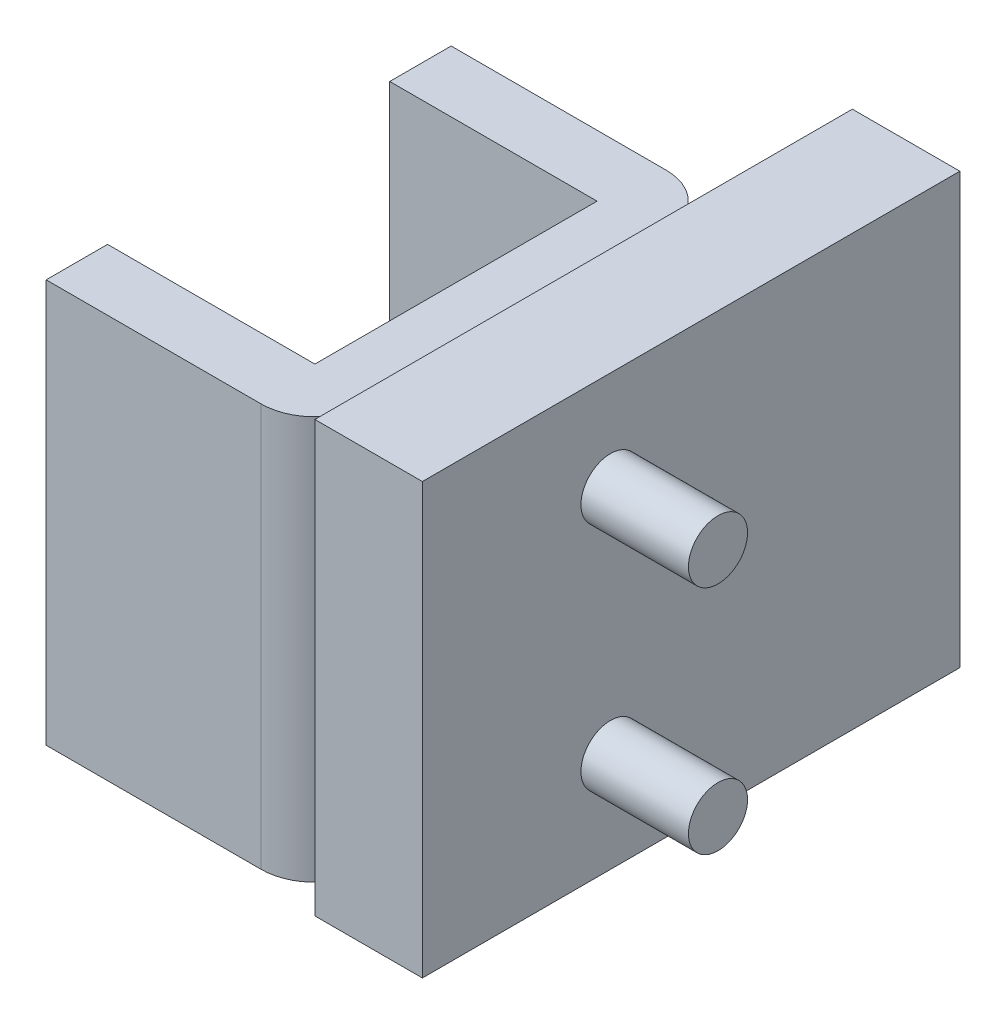
ISO-10303-21;
HEADER;
FILE_DESCRIPTION(('STEP AP214'),'2;1');
FILE_NAME('part.step','',(''),(''),'','','');
FILE_SCHEMA(('AUTOMOTIVE_DESIGN { 1 0 10303 214 1 1 1 1 }'));
ENDSEC;
DATA;
#1=APPLICATION_CONTEXT('core data for automotive mechanical design processes');
#2=APPLICATION_PROTOCOL_DEFINITION('international standard','automotive_design',2000,#1);
#3=PRODUCT_CONTEXT('',#1,'mechanical');
#4=PRODUCT('Part','Part','',(#3));
#5=PRODUCT_RELATED_PRODUCT_CATEGORY('part','',(#4));
#6=PRODUCT_DEFINITION_FORMATION('','',#4);
#7=PRODUCT_DEFINITION_CONTEXT('part definition',#1,'design');
#8=PRODUCT_DEFINITION('design','',#6,#7);
#9=PRODUCT_DEFINITION_SHAPE('','',#8);
#10=(LENGTH_UNIT() NAMED_UNIT(*) SI_UNIT(.MILLI.,.METRE.));
#11=(NAMED_UNIT(*) PLANE_ANGLE_UNIT() SI_UNIT($,.RADIAN.));
#12=(NAMED_UNIT(*) SI_UNIT($,.STERADIAN.) SOLID_ANGLE_UNIT());
#13=UNCERTAINTY_MEASURE_WITH_UNIT(LENGTH_MEASURE(1.E-05),#10,'distance_accuracy_value','');
#14=(GEOMETRIC_REPRESENTATION_CONTEXT(3) GLOBAL_UNCERTAINTY_ASSIGNED_CONTEXT((#13)) GLOBAL_UNIT_ASSIGNED_CONTEXT((#10,
#11,#12)) REPRESENTATION_CONTEXT('',''));
#15=CARTESIAN_POINT('',(0.,0.,0.));
#16=DIRECTION('',(0.,0.,1.));
#17=DIRECTION('',(1.,0.,0.));
#18=AXIS2_PLACEMENT_3D('',#15,#16,#17);
#19=CARTESIAN_POINT('',(-35.941253920068,15.,-35.7928941984103));
#20=DIRECTION('',(1.,0.,0.));
#21=DIRECTION('',(0.,0.,-1.));
#22=AXIS2_PLACEMENT_3D('',#19,#20,#21);
#23=PLANE('',#22);
#24=DIRECTION('',(0.,0.,1.));
#25=VECTOR('',#24,1.);
#26=CARTESIAN_POINT('',(-35.941253920068,15.,-35.7928941984103));
#27=LINE('',#26,#25);
#28=CARTESIAN_POINT('',(-35.941253920068,15.,-23.0078941984103));
#29=VERTEX_POINT('',#28);
#30=CARTESIAN_POINT('',(-35.941253920068,15.,-20.7228941984103));
#31=VERTEX_POINT('',#30);
#32=EDGE_CURVE('E211',#29,#31,#27,.T.);
#33=ORIENTED_EDGE('',*,*,#32,.F.);
#34=DIRECTION('',(0.,1.,0.));
#35=VECTOR('',#34,1.);
#36=CARTESIAN_POINT('',(-35.941253920068,0.,-23.0078941984103));
#37=LINE('',#36,#35);
#38=CARTESIAN_POINT('',(-35.941253920068,0.,-23.0078941984103));
#39=VERTEX_POINT('',#38);
#40=EDGE_CURVE('E173',#39,#29,#37,.T.);
#41=ORIENTED_EDGE('',*,*,#40,.F.);
#42=DIRECTION('',(0.,0.,1.));
#43=VECTOR('',#42,1.);
#44=CARTESIAN_POINT('',(-35.941253920068,0.,-35.7928941984103));
#45=LINE('',#44,#43);
#46=CARTESIAN_POINT('',(-35.941253920068,0.,-20.7228941984103));
#47=VERTEX_POINT('',#46);
#48=EDGE_CURVE('E233',#39,#47,#45,.T.);
#49=ORIENTED_EDGE('',*,*,#48,.T.);
#50=DIRECTION('',(0.,-1.,0.));
#51=VECTOR('',#50,1.);
#52=CARTESIAN_POINT('',(-35.941253920068,15.,-20.7228941984103));
#53=LINE('',#52,#51);
#54=EDGE_CURVE('E47',#31,#47,#53,.T.);
#55=ORIENTED_EDGE('',*,*,#54,.F.);
#56=EDGE_LOOP('',(#33,#41,#49,#55));
#57=FACE_BOUND('',#56,.T.);
#58=ADVANCED_FACE('F38',(#57),#23,.F.);
#59=CARTESIAN_POINT('',(-35.941253920068,15.,-35.7928941984103));
#60=DIRECTION('',(0.,0.,1.));
#61=DIRECTION('',(1.,0.,0.));
#62=AXIS2_PLACEMENT_3D('',#59,#60,#61);
#63=PLANE('',#62);
#64=DIRECTION('',(-1.,0.,0.));
#65=VECTOR('',#64,1.);
#66=CARTESIAN_POINT('',(-35.941253920068,0.,-35.7928941984103));
#67=LINE('',#66,#65);
#68=CARTESIAN_POINT('',(-27.941253920068,0.,-35.7928941984103));
#69=VERTEX_POINT('',#68);
#70=CARTESIAN_POINT('',(-35.941253920068,0.,-35.7928941984103));
#71=VERTEX_POINT('',#70);
#72=EDGE_CURVE('E204',#69,#71,#67,.T.);
#73=ORIENTED_EDGE('',*,*,#72,.T.);
#74=DIRECTION('',(0.,-1.,0.));
#75=VECTOR('',#74,1.);
#76=CARTESIAN_POINT('',(-35.941253920068,15.,-35.7928941984103));
#77=LINE('',#76,#75);
#78=CARTESIAN_POINT('',(-35.941253920068,15.,-35.7928941984103));
#79=VERTEX_POINT('',#78);
#80=EDGE_CURVE('E11',#79,#71,#77,.T.);
#81=ORIENTED_EDGE('',*,*,#80,.F.);
#82=DIRECTION('',(-1.,0.,0.));
#83=VECTOR('',#82,1.);
#84=CARTESIAN_POINT('',(-35.941253920068,15.,-35.7928941984103));
#85=LINE('',#84,#83);
#86=CARTESIAN_POINT('',(-27.941253920068,15.,-35.7928941984103));
#87=VERTEX_POINT('',#86);
#88=EDGE_CURVE('E207',#87,#79,#85,.T.);
#89=ORIENTED_EDGE('',*,*,#88,.F.);
#90=DIRECTION('',(0.,-1.,0.));
#91=VECTOR('',#90,1.);
#92=CARTESIAN_POINT('',(-27.941253920068,15.,-35.7928941984103));
#93=LINE('',#92,#91);
#94=EDGE_CURVE('E229',#87,#69,#93,.T.);
#95=ORIENTED_EDGE('',*,*,#94,.T.);
#96=EDGE_LOOP('',(#73,#81,#89,#95));
#97=FACE_BOUND('',#96,.T.);
#98=ADVANCED_FACE('F40',(#97),#63,.F.);
#99=CARTESIAN_POINT('',(-35.941253920068,0.,-33.5078941984103));
#100=VERTEX_POINT('',#99);
#101=EDGE_CURVE('E234',#71,#100,#45,.T.);
#102=ORIENTED_EDGE('',*,*,#101,.T.);
#103=DIRECTION('',(0.,1.,0.));
#104=VECTOR('',#103,1.);
#105=CARTESIAN_POINT('',(-35.941253920068,0.,-33.5078941984103));
#106=LINE('',#105,#104);
#107=CARTESIAN_POINT('',(-35.941253920068,15.,-33.5078941984103));
#108=VERTEX_POINT('',#107);
#109=EDGE_CURVE('E168',#100,#108,#106,.T.);
#110=ORIENTED_EDGE('',*,*,#109,.T.);
#111=EDGE_CURVE('E213',#79,#108,#27,.T.);
#112=ORIENTED_EDGE('',*,*,#111,.F.);
#113=ORIENTED_EDGE('',*,*,#80,.T.);
#114=EDGE_LOOP('',(#102,#110,#112,#113));
#115=FACE_BOUND('',#114,.T.);
#116=ADVANCED_FACE('F298',(#115),#23,.F.);
#117=CARTESIAN_POINT('',(-35.941253920068,15.,-20.7228941984103));
#118=DIRECTION('',(0.,0.,-1.));
#119=DIRECTION('',(-1.,0.,0.));
#120=AXIS2_PLACEMENT_3D('',#117,#118,#119);
#121=PLANE('',#120);
#122=DIRECTION('',(1.,0.,0.));
#123=VECTOR('',#122,1.);
#124=CARTESIAN_POINT('',(-35.941253920068,0.,-20.7228941984103));
#125=LINE('',#124,#123);
#126=CARTESIAN_POINT('',(-27.941253920068,0.,-20.7228941984103));
#127=VERTEX_POINT('',#126);
#128=EDGE_CURVE('E238',#47,#127,#125,.T.);
#129=ORIENTED_EDGE('',*,*,#128,.T.);
#130=DIRECTION('',(0.,-1.,0.));
#131=VECTOR('',#130,1.);
#132=CARTESIAN_POINT('',(-27.941253920068,15.,-20.7228941984103));
#133=LINE('',#132,#131);
#134=CARTESIAN_POINT('',(-27.941253920068,15.,-20.7228941984103));
#135=VERTEX_POINT('',#134);
#136=EDGE_CURVE('E261',#135,#127,#133,.T.);
#137=ORIENTED_EDGE('',*,*,#136,.F.);
#138=DIRECTION('',(1.,0.,0.));
#139=VECTOR('',#138,1.);
#140=CARTESIAN_POINT('',(-35.941253920068,15.,-20.7228941984103));
#141=LINE('',#140,#139);
#142=EDGE_CURVE('E217',#31,#135,#141,.T.);
#143=ORIENTED_EDGE('',*,*,#142,.F.);
#144=ORIENTED_EDGE('',*,*,#54,.T.);
#145=EDGE_LOOP('',(#129,#137,#143,#144));
#146=FACE_BOUND('',#145,.T.);
#147=ADVANCED_FACE('F270',(#146),#121,.F.);
#148=CARTESIAN_POINT('',(-27.941253920068,15.,-22.7228941984103));
#149=DIRECTION('',(0.,-1.,0.));
#150=DIRECTION('',(0.,0.,-1.));
#151=AXIS2_PLACEMENT_3D('',#148,#149,#150);
#152=CYLINDRICAL_SURFACE('',#151,2.);
#153=CARTESIAN_POINT('',(-27.941253920068,0.,-22.7228941984103));
#154=DIRECTION('',(0.,1.,0.));
#155=DIRECTION('',(0.,0.,1.));
#156=AXIS2_PLACEMENT_3D('',#153,#154,#155);
#157=CIRCLE('',#156,2.);
#158=CARTESIAN_POINT('',(-25.941253920068,0.,-22.7228941984103));
#159=VERTEX_POINT('',#158);
#160=EDGE_CURVE('E241',#127,#159,#157,.T.);
#161=ORIENTED_EDGE('',*,*,#160,.T.);
#162=DIRECTION('',(0.,-1.,0.));
#163=VECTOR('',#162,1.);
#164=CARTESIAN_POINT('',(-25.941253920068,15.,-22.7228941984103));
#165=LINE('',#164,#163);
#166=CARTESIAN_POINT('',(-25.941253920068,15.,-22.7228941984103));
#167=VERTEX_POINT('',#166);
#168=EDGE_CURVE('E257',#167,#159,#165,.T.);
#169=ORIENTED_EDGE('',*,*,#168,.F.);
#170=CARTESIAN_POINT('',(-27.941253920068,15.,-22.7228941984103));
#171=DIRECTION('',(0.,1.,0.));
#172=DIRECTION('',(0.,0.,1.));
#173=AXIS2_PLACEMENT_3D('',#170,#171,#172);
#174=CIRCLE('',#173,2.);
#175=EDGE_CURVE('E220',#135,#167,#174,.T.);
#176=ORIENTED_EDGE('',*,*,#175,.F.);
#177=ORIENTED_EDGE('',*,*,#136,.T.);
#178=EDGE_LOOP('',(#161,#169,#176,#177));
#179=FACE_BOUND('',#178,.T.);
#180=ADVANCED_FACE('F281',(#179),#152,.T.);
#181=CARTESIAN_POINT('',(-27.941253920068,15.,-33.7928941984103));
#182=DIRECTION('',(0.,-1.,0.));
#183=DIRECTION('',(0.,0.,-1.));
#184=AXIS2_PLACEMENT_3D('',#181,#182,#183);
#185=CYLINDRICAL_SURFACE('',#184,2.);
#186=CARTESIAN_POINT('',(-27.941253920068,0.,-33.7928941984103));
#187=DIRECTION('',(0.,1.,0.));
#188=DIRECTION('',(0.,0.,-1.));
#189=AXIS2_PLACEMENT_3D('',#186,#187,#188);
#190=CIRCLE('',#189,2.);
#191=CARTESIAN_POINT('',(-25.941253920068,0.,-33.7928941984103));
#192=VERTEX_POINT('',#191);
#193=EDGE_CURVE('E212',#192,#69,#190,.T.);
#194=ORIENTED_EDGE('',*,*,#193,.T.);
#195=ORIENTED_EDGE('',*,*,#94,.F.);
#196=CARTESIAN_POINT('',(-27.941253920068,15.,-33.7928941984103));
#197=DIRECTION('',(0.,1.,0.));
#198=DIRECTION('',(0.,0.,-1.));
#199=AXIS2_PLACEMENT_3D('',#196,#197,#198);
#200=CIRCLE('',#199,2.);
#201=CARTESIAN_POINT('',(-25.941253920068,15.,-33.7928941984103));
#202=VERTEX_POINT('',#201);
#203=EDGE_CURVE('E226',#202,#87,#200,.T.);
#204=ORIENTED_EDGE('',*,*,#203,.F.);
#205=DIRECTION('',(0.,-1.,0.));
#206=VECTOR('',#205,1.);
#207=CARTESIAN_POINT('',(-25.941253920068,15.,-33.7928941984103));
#208=LINE('',#207,#206);
#209=EDGE_CURVE('E253',#202,#192,#208,.T.);
#210=ORIENTED_EDGE('',*,*,#209,.T.);
#211=EDGE_LOOP('',(#194,#195,#204,#210));
#212=FACE_BOUND('',#211,.T.);
#213=ADVANCED_FACE('F306',(#212),#185,.T.);
#214=CARTESIAN_POINT('',(-27.941253920068,15.,-33.7928941984103));
#215=DIRECTION('',(0.,-1.,0.));
#216=DIRECTION('',(0.,0.,-1.));
#217=AXIS2_PLACEMENT_3D('',#214,#215,#216);
#218=PLANE('',#217);
#219=DIRECTION('',(1.,0.,0.));
#220=VECTOR('',#219,1.);
#221=CARTESIAN_POINT('',(0.,15.,-23.0078941984103));
#222=LINE('',#221,#220);
#223=CARTESIAN_POINT('',(-28.226253920068,15.,-23.0078941984103));
#224=VERTEX_POINT('',#223);
#225=EDGE_CURVE('E54',#29,#224,#222,.T.);
#226=ORIENTED_EDGE('',*,*,#225,.F.);
#227=ORIENTED_EDGE('',*,*,#32,.T.);
#228=ORIENTED_EDGE('',*,*,#142,.T.);
#229=ORIENTED_EDGE('',*,*,#175,.T.);
#230=DIRECTION('',(0.,0.,-1.));
#231=VECTOR('',#230,1.);
#232=CARTESIAN_POINT('',(-25.941253920068,15.,-33.7928941984103));
#233=LINE('',#232,#231);
#234=EDGE_CURVE('E223',#167,#202,#233,.T.);
#235=ORIENTED_EDGE('',*,*,#234,.T.);
#236=ORIENTED_EDGE('',*,*,#203,.T.);
#237=ORIENTED_EDGE('',*,*,#88,.T.);
#238=ORIENTED_EDGE('',*,*,#111,.T.);
#239=DIRECTION('',(-1.,0.,0.));
#240=VECTOR('',#239,1.);
#241=CARTESIAN_POINT('',(0.,15.,-33.5078941984103));
#242=LINE('',#241,#240);
#243=CARTESIAN_POINT('',(-28.226253920068,15.,-33.5078941984103));
#244=VERTEX_POINT('',#243);
#245=EDGE_CURVE('E186',#244,#108,#242,.T.);
#246=ORIENTED_EDGE('',*,*,#245,.F.);
#247=DIRECTION('',(0.,0.,-1.));
#248=VECTOR('',#247,1.);
#249=CARTESIAN_POINT('',(-28.226253920068,15.,0.));
#250=LINE('',#249,#248);
#251=EDGE_CURVE('E195',#224,#244,#250,.T.);
#252=ORIENTED_EDGE('',*,*,#251,.F.);
#253=EDGE_LOOP('',(#226,#227,#228,#229,#235,#236,#237,#238,#246,#252));
#254=FACE_BOUND('',#253,.T.);
#255=ADVANCED_FACE('F285',(#254),#218,.F.);
#256=CARTESIAN_POINT('',(-27.941253920068,0.,-33.7928941984103));
#257=DIRECTION('',(0.,-1.,0.));
#258=DIRECTION('',(0.,0.,-1.));
#259=AXIS2_PLACEMENT_3D('',#256,#257,#258);
#260=PLANE('',#259);
#261=ORIENTED_EDGE('',*,*,#48,.F.);
#262=DIRECTION('',(1.,0.,0.));
#263=VECTOR('',#262,1.);
#264=CARTESIAN_POINT('',(0.,0.,-23.0078941984103));
#265=LINE('',#264,#263);
#266=CARTESIAN_POINT('',(-28.226253920068,0.,-23.0078941984103));
#267=VERTEX_POINT('',#266);
#268=EDGE_CURVE('E181',#39,#267,#265,.T.);
#269=ORIENTED_EDGE('',*,*,#268,.T.);
#270=DIRECTION('',(0.,0.,-1.));
#271=VECTOR('',#270,1.);
#272=CARTESIAN_POINT('',(-28.226253920068,0.,0.));
#273=LINE('',#272,#271);
#274=CARTESIAN_POINT('',(-28.226253920068,0.,-33.5078941984103));
#275=VERTEX_POINT('',#274);
#276=EDGE_CURVE('E185',#267,#275,#273,.T.);
#277=ORIENTED_EDGE('',*,*,#276,.T.);
#278=DIRECTION('',(-1.,0.,0.));
#279=VECTOR('',#278,1.);
#280=CARTESIAN_POINT('',(0.,0.,-33.5078941984103));
#281=LINE('',#280,#279);
#282=EDGE_CURVE('E62',#275,#100,#281,.T.);
#283=ORIENTED_EDGE('',*,*,#282,.T.);
#284=ORIENTED_EDGE('',*,*,#101,.F.);
#285=ORIENTED_EDGE('',*,*,#72,.F.);
#286=ORIENTED_EDGE('',*,*,#193,.F.);
#287=DIRECTION('',(0.,0.,-1.));
#288=VECTOR('',#287,1.);
#289=CARTESIAN_POINT('',(-25.941253920068,0.,-33.7928941984103));
#290=LINE('',#289,#288);
#291=EDGE_CURVE('E244',#159,#192,#290,.T.);
#292=ORIENTED_EDGE('',*,*,#291,.F.);
#293=ORIENTED_EDGE('',*,*,#160,.F.);
#294=ORIENTED_EDGE('',*,*,#128,.F.);
#295=EDGE_LOOP('',(#261,#269,#277,#283,#284,#285,#286,#292,#293,#294));
#296=FACE_BOUND('',#295,.T.);
#297=ADVANCED_FACE('F277',(#296),#260,.T.);
#298=CARTESIAN_POINT('',(0.,0.,-23.0078941984103));
#299=DIRECTION('',(0.,0.,1.));
#300=DIRECTION('',(1.,0.,0.));
#301=AXIS2_PLACEMENT_3D('',#298,#299,#300);
#302=PLANE('',#301);
#303=ORIENTED_EDGE('',*,*,#225,.T.);
#304=DIRECTION('',(0.,1.,0.));
#305=VECTOR('',#304,1.);
#306=CARTESIAN_POINT('',(-28.226253920068,0.,-23.0078941984103));
#307=LINE('',#306,#305);
#308=EDGE_CURVE('E192',#267,#224,#307,.T.);
#309=ORIENTED_EDGE('',*,*,#308,.F.);
#310=ORIENTED_EDGE('',*,*,#268,.F.);
#311=ORIENTED_EDGE('',*,*,#40,.T.);
#312=EDGE_LOOP('',(#303,#309,#310,#311));
#313=FACE_BOUND('',#312,.T.);
#314=ADVANCED_FACE('F291',(#313),#302,.F.);
#315=CARTESIAN_POINT('',(0.,0.,-33.5078941984103));
#316=DIRECTION('',(0.,0.,-1.));
#317=DIRECTION('',(-1.,0.,0.));
#318=AXIS2_PLACEMENT_3D('',#315,#316,#317);
#319=PLANE('',#318);
#320=ORIENTED_EDGE('',*,*,#245,.T.);
#321=ORIENTED_EDGE('',*,*,#109,.F.);
#322=ORIENTED_EDGE('',*,*,#282,.F.);
#323=DIRECTION('',(0.,1.,0.));
#324=VECTOR('',#323,1.);
#325=CARTESIAN_POINT('',(-28.226253920068,0.,-33.5078941984103));
#326=LINE('',#325,#324);
#327=EDGE_CURVE('E201',#275,#244,#326,.T.);
#328=ORIENTED_EDGE('',*,*,#327,.T.);
#329=EDGE_LOOP('',(#320,#321,#322,#328));
#330=FACE_BOUND('',#329,.T.);
#331=ADVANCED_FACE('F296',(#330),#319,.F.);
#332=CARTESIAN_POINT('',(-28.226253920068,0.,0.));
#333=DIRECTION('',(1.,0.,0.));
#334=DIRECTION('',(0.,0.,-1.));
#335=AXIS2_PLACEMENT_3D('',#332,#333,#334);
#336=PLANE('',#335);
#337=ORIENTED_EDGE('',*,*,#251,.T.);
#338=ORIENTED_EDGE('',*,*,#327,.F.);
#339=ORIENTED_EDGE('',*,*,#276,.F.);
#340=ORIENTED_EDGE('',*,*,#308,.T.);
#341=EDGE_LOOP('',(#337,#338,#339,#340));
#342=FACE_BOUND('',#341,.T.);
#343=ADVANCED_FACE('F294',(#342),#336,.F.);
#344=CARTESIAN_POINT('',(-25.941253920068,0.,0.));
#345=DIRECTION('',(1.,0.,0.));
#346=DIRECTION('',(0.,0.,-1.));
#347=AXIS2_PLACEMENT_3D('',#344,#345,#346);
#348=PLANE('',#347);
#349=DIRECTION('',(0.,-1.,0.));
#350=VECTOR('',#349,1.);
#351=CARTESIAN_POINT('',(-25.941253920068,15.5,-20.7228941984103));
#352=LINE('',#351,#350);
#353=CARTESIAN_POINT('',(-25.941253920068,15.5,-20.7228941984103));
#354=VERTEX_POINT('',#353);
#355=CARTESIAN_POINT('',(-25.941253920068,-0.5,-20.7228941984103));
#356=VERTEX_POINT('',#355);
#357=EDGE_CURVE('E166',#354,#356,#352,.T.);
#358=ORIENTED_EDGE('',*,*,#357,.F.);
#359=DIRECTION('',(0.,0.,1.));
#360=VECTOR('',#359,1.);
#361=CARTESIAN_POINT('',(-25.941253920068,15.5,-40.7228941984103));
#362=LINE('',#361,#360);
#363=CARTESIAN_POINT('',(-25.941253920068,15.5,-40.7228941984103));
#364=VERTEX_POINT('',#363);
#365=EDGE_CURVE('E162',#364,#354,#362,.T.);
#366=ORIENTED_EDGE('',*,*,#365,.F.);
#367=DIRECTION('',(0.,1.,0.));
#368=VECTOR('',#367,1.);
#369=CARTESIAN_POINT('',(-25.941253920068,-0.5,-40.7228941984103));
#370=LINE('',#369,#368);
#371=CARTESIAN_POINT('',(-25.941253920068,-0.5,-40.7228941984103));
#372=VERTEX_POINT('',#371);
#373=EDGE_CURVE('E363',#372,#364,#370,.T.);
#374=ORIENTED_EDGE('',*,*,#373,.F.);
#375=DIRECTION('',(0.,0.,-1.));
#376=VECTOR('',#375,1.);
#377=CARTESIAN_POINT('',(-25.941253920068,-0.5,-20.7228941984103));
#378=LINE('',#377,#376);
#379=EDGE_CURVE('E367',#356,#372,#378,.T.);
#380=ORIENTED_EDGE('',*,*,#379,.F.);
#381=EDGE_LOOP('',(#358,#366,#374,#380));
#382=FACE_BOUND('',#381,.T.);
#383=ORIENTED_EDGE('',*,*,#209,.F.);
#384=ORIENTED_EDGE('',*,*,#234,.F.);
#385=ORIENTED_EDGE('',*,*,#168,.T.);
#386=ORIENTED_EDGE('',*,*,#291,.T.);
#387=EDGE_LOOP('',(#383,#384,#385,#386));
#388=FACE_BOUND('',#387,.T.);
#389=ADVANCED_FACE('F308',(#382,#388),#348,.F.);
#390=CARTESIAN_POINT('',(-21.941253920068,15.5,-20.7228941984103));
#391=DIRECTION('',(0.,0.,-1.));
#392=DIRECTION('',(0.,1.,0.));
#393=AXIS2_PLACEMENT_3D('',#390,#391,#392);
#394=PLANE('',#393);
#395=ORIENTED_EDGE('',*,*,#357,.T.);
#396=DIRECTION('',(-1.,0.,0.));
#397=VECTOR('',#396,1.);
#398=CARTESIAN_POINT('',(-21.941253920068,-0.5,-20.7228941984103));
#399=LINE('',#398,#397);
#400=CARTESIAN_POINT('',(-21.941253920068,-0.5,-20.7228941984103));
#401=VERTEX_POINT('',#400);
#402=EDGE_CURVE('E144',#401,#356,#399,.T.);
#403=ORIENTED_EDGE('',*,*,#402,.F.);
#404=DIRECTION('',(0.,-1.,0.));
#405=VECTOR('',#404,1.);
#406=CARTESIAN_POINT('',(-21.941253920068,15.5,-20.7228941984103));
#407=LINE('',#406,#405);
#408=CARTESIAN_POINT('',(-21.941253920068,15.5,-20.7228941984103));
#409=VERTEX_POINT('',#408);
#410=EDGE_CURVE('E152',#409,#401,#407,.T.);
#411=ORIENTED_EDGE('',*,*,#410,.F.);
#412=DIRECTION('',(-1.,0.,0.));
#413=VECTOR('',#412,1.);
#414=CARTESIAN_POINT('',(-21.941253920068,15.5,-20.7228941984103));
#415=LINE('',#414,#413);
#416=EDGE_CURVE('E359',#409,#354,#415,.T.);
#417=ORIENTED_EDGE('',*,*,#416,.T.);
#418=EDGE_LOOP('',(#395,#403,#411,#417));
#419=FACE_BOUND('',#418,.T.);
#420=ADVANCED_FACE('F164',(#419),#394,.F.);
#421=CARTESIAN_POINT('',(-21.941253920068,-0.5,-20.7228941984103));
#422=DIRECTION('',(0.,1.,0.));
#423=DIRECTION('',(0.,0.,1.));
#424=AXIS2_PLACEMENT_3D('',#421,#422,#423);
#425=PLANE('',#424);
#426=ORIENTED_EDGE('',*,*,#379,.T.);
#427=DIRECTION('',(-1.,0.,0.));
#428=VECTOR('',#427,1.);
#429=CARTESIAN_POINT('',(-21.941253920068,-0.5,-40.7228941984103));
#430=LINE('',#429,#428);
#431=CARTESIAN_POINT('',(-21.941253920068,-0.5,-40.7228941984103));
#432=VERTEX_POINT('',#431);
#433=EDGE_CURVE('E147',#432,#372,#430,.T.);
#434=ORIENTED_EDGE('',*,*,#433,.F.);
#435=DIRECTION('',(0.,0.,-1.));
#436=VECTOR('',#435,1.);
#437=CARTESIAN_POINT('',(-21.941253920068,-0.5,-20.7228941984103));
#438=LINE('',#437,#436);
#439=EDGE_CURVE('E140',#401,#432,#438,.T.);
#440=ORIENTED_EDGE('',*,*,#439,.F.);
#441=ORIENTED_EDGE('',*,*,#402,.T.);
#442=EDGE_LOOP('',(#426,#434,#440,#441));
#443=FACE_BOUND('',#442,.T.);
#444=ADVANCED_FACE('F142',(#443),#425,.F.);
#445=CARTESIAN_POINT('',(-21.941253920068,-0.5,-40.7228941984103));
#446=DIRECTION('',(0.,0.,1.));
#447=DIRECTION('',(1.,0.,0.));
#448=AXIS2_PLACEMENT_3D('',#445,#446,#447);
#449=PLANE('',#448);
#450=ORIENTED_EDGE('',*,*,#373,.T.);
#451=DIRECTION('',(-1.,0.,0.));
#452=VECTOR('',#451,1.);
#453=CARTESIAN_POINT('',(-21.941253920068,15.5,-40.7228941984103));
#454=LINE('',#453,#452);
#455=CARTESIAN_POINT('',(-21.941253920068,15.5,-40.7228941984103));
#456=VERTEX_POINT('',#455);
#457=EDGE_CURVE('E175',#456,#364,#454,.T.);
#458=ORIENTED_EDGE('',*,*,#457,.F.);
#459=DIRECTION('',(0.,1.,0.));
#460=VECTOR('',#459,1.);
#461=CARTESIAN_POINT('',(-21.941253920068,-0.5,-40.7228941984103));
#462=LINE('',#461,#460);
#463=EDGE_CURVE('E151',#432,#456,#462,.T.);
#464=ORIENTED_EDGE('',*,*,#463,.F.);
#465=ORIENTED_EDGE('',*,*,#433,.T.);
#466=EDGE_LOOP('',(#450,#458,#464,#465));
#467=FACE_BOUND('',#466,.T.);
#468=ADVANCED_FACE('F346',(#467),#449,.F.);
#469=CARTESIAN_POINT('',(-21.941253920068,15.5,-40.7228941984103));
#470=DIRECTION('',(0.,-1.,0.));
#471=DIRECTION('',(0.,0.,-1.));
#472=AXIS2_PLACEMENT_3D('',#469,#470,#471);
#473=PLANE('',#472);
#474=ORIENTED_EDGE('',*,*,#365,.T.);
#475=ORIENTED_EDGE('',*,*,#416,.F.);
#476=DIRECTION('',(0.,0.,1.));
#477=VECTOR('',#476,1.);
#478=CARTESIAN_POINT('',(-21.941253920068,15.5,-40.7228941984103));
#479=LINE('',#478,#477);
#480=EDGE_CURVE('E157',#456,#409,#479,.T.);
#481=ORIENTED_EDGE('',*,*,#480,.F.);
#482=ORIENTED_EDGE('',*,*,#457,.T.);
#483=EDGE_LOOP('',(#474,#475,#481,#482));
#484=FACE_BOUND('',#483,.T.);
#485=ADVANCED_FACE('F348',(#484),#473,.F.);
#486=CARTESIAN_POINT('',(-21.941253920068,0.,0.));
#487=DIRECTION('',(1.,0.,0.));
#488=DIRECTION('',(0.,0.,-1.));
#489=AXIS2_PLACEMENT_3D('',#486,#487,#488);
#490=PLANE('',#489);
#491=CARTESIAN_POINT('',(-21.941253920068,3.2,-27.7228941984103));
#492=DIRECTION('',(1.,0.,0.));
#493=DIRECTION('',(0.,0.,-1.));
#494=AXIS2_PLACEMENT_3D('',#491,#492,#493);
#495=CIRCLE('',#494,1.1);
#496=CARTESIAN_POINT('',(-21.941253920068,3.2,-28.8228941984103));
#497=VERTEX_POINT('',#496);
#498=EDGE_CURVE('E389',#497,#497,#495,.T.);
#499=ORIENTED_EDGE('',*,*,#498,.F.);
#500=EDGE_LOOP('',(#499));
#501=FACE_BOUND('',#500,.T.);
#502=CARTESIAN_POINT('',(-21.941253920068,11.8,-27.7228941984103));
#503=DIRECTION('',(1.,0.,0.));
#504=DIRECTION('',(0.,0.,-1.));
#505=AXIS2_PLACEMENT_3D('',#502,#503,#504);
#506=CIRCLE('',#505,1.1);
#507=CARTESIAN_POINT('',(-21.941253920068,11.8,-28.8228941984103));
#508=VERTEX_POINT('',#507);
#509=EDGE_CURVE('E375',#508,#508,#506,.T.);
#510=ORIENTED_EDGE('',*,*,#509,.F.);
#511=EDGE_LOOP('',(#510));
#512=FACE_BOUND('',#511,.T.);
#513=ORIENTED_EDGE('',*,*,#410,.T.);
#514=ORIENTED_EDGE('',*,*,#439,.T.);
#515=ORIENTED_EDGE('',*,*,#463,.T.);
#516=ORIENTED_EDGE('',*,*,#480,.T.);
#517=EDGE_LOOP('',(#513,#514,#515,#516));
#518=FACE_BOUND('',#517,.T.);
#519=ADVANCED_FACE('F155',(#501,#512,#518),#490,.T.);
#520=CARTESIAN_POINT('',(-17.941253920068,11.8,-27.7228941984103));
#521=DIRECTION('',(-1.,0.,0.));
#522=DIRECTION('',(0.,0.,1.));
#523=AXIS2_PLACEMENT_3D('',#520,#521,#522);
#524=CYLINDRICAL_SURFACE('',#523,1.1);
#525=CARTESIAN_POINT('',(-17.941253920068,11.8,-27.7228941984103));
#526=DIRECTION('',(1.,0.,0.));
#527=DIRECTION('',(0.,0.,-1.));
#528=AXIS2_PLACEMENT_3D('',#525,#526,#527);
#529=CIRCLE('',#528,1.1);
#530=CARTESIAN_POINT('',(-17.941253920068,11.8,-28.8228941984103));
#531=VERTEX_POINT('',#530);
#532=EDGE_CURVE('E369',#531,#531,#529,.T.);
#533=ORIENTED_EDGE('',*,*,#532,.F.);
#534=EDGE_LOOP('',(#533));
#535=FACE_BOUND('',#534,.T.);
#536=ORIENTED_EDGE('',*,*,#509,.T.);
#537=EDGE_LOOP('',(#536));
#538=FACE_BOUND('',#537,.T.);
#539=ADVANCED_FACE('F355',(#535,#538),#524,.T.);
#540=CARTESIAN_POINT('',(-17.941253920068,11.8,-27.7228941984103));
#541=DIRECTION('',(1.,0.,0.));
#542=DIRECTION('',(0.,0.,-1.));
#543=AXIS2_PLACEMENT_3D('',#540,#541,#542);
#544=PLANE('',#543);
#545=ORIENTED_EDGE('',*,*,#532,.T.);
#546=EDGE_LOOP('',(#545));
#547=FACE_BOUND('',#546,.T.);
#548=ADVANCED_FACE('F402',(#547),#544,.T.);
#549=CARTESIAN_POINT('',(-17.941253920068,3.2,-27.7228941984103));
#550=DIRECTION('',(-1.,0.,0.));
#551=DIRECTION('',(0.,0.,1.));
#552=AXIS2_PLACEMENT_3D('',#549,#550,#551);
#553=CYLINDRICAL_SURFACE('',#552,1.1);
#554=CARTESIAN_POINT('',(-17.941253920068,3.2,-27.7228941984103));
#555=DIRECTION('',(1.,0.,0.));
#556=DIRECTION('',(0.,0.,-1.));
#557=AXIS2_PLACEMENT_3D('',#554,#555,#556);
#558=CIRCLE('',#557,1.1);
#559=CARTESIAN_POINT('',(-17.941253920068,3.2,-28.8228941984103));
#560=VERTEX_POINT('',#559);
#561=EDGE_CURVE('E387',#560,#560,#558,.T.);
#562=ORIENTED_EDGE('',*,*,#561,.F.);
#563=EDGE_LOOP('',(#562));
#564=FACE_BOUND('',#563,.T.);
#565=ORIENTED_EDGE('',*,*,#498,.T.);
#566=EDGE_LOOP('',(#565));
#567=FACE_BOUND('',#566,.T.);
#568=ADVANCED_FACE('F399',(#564,#567),#553,.T.);
#569=CARTESIAN_POINT('',(-17.941253920068,3.2,-27.7228941984103));
#570=DIRECTION('',(1.,0.,0.));
#571=DIRECTION('',(0.,0.,-1.));
#572=AXIS2_PLACEMENT_3D('',#569,#570,#571);
#573=PLANE('',#572);
#574=ORIENTED_EDGE('',*,*,#561,.T.);
#575=EDGE_LOOP('',(#574));
#576=FACE_BOUND('',#575,.T.);
#577=ADVANCED_FACE('F397',(#576),#573,.T.);
#578=CLOSED_SHELL('',(#58,#98,#116,#147,#180,#213,#255,#297,#314,#331,#343,#389,#420,#444,#468,
#485,#519,#539,#548,#568,#577));
#579=MANIFOLD_SOLID_BREP('B2',#578);
#580=ADVANCED_BREP_SHAPE_REPRESENTATION('',(#18,#579),#14);
#581=SHAPE_DEFINITION_REPRESENTATION(#9,#580);
ENDSEC;
END-ISO-10303-21;
